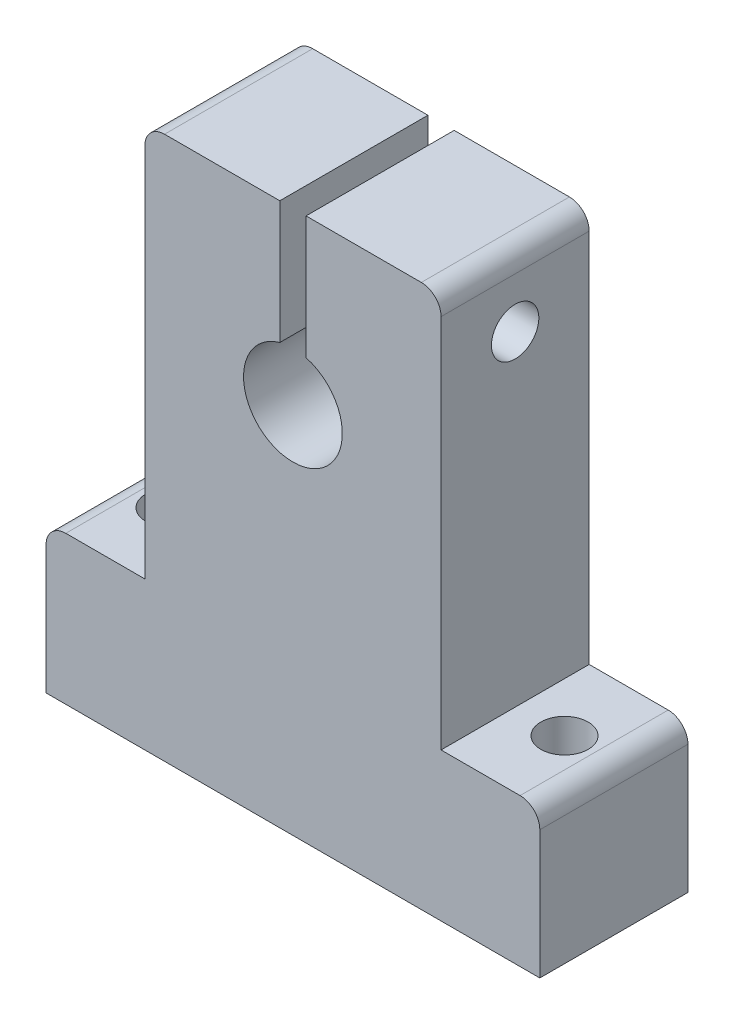
ISO-10303-21;
HEADER;
FILE_DESCRIPTION(('STEP AP214'),'2;1');
FILE_NAME('part.step','',(''),(''),'','','');
FILE_SCHEMA(('AUTOMOTIVE_DESIGN { 1 0 10303 214 1 1 1 1 }'));
ENDSEC;
DATA;
#1=APPLICATION_CONTEXT('core data for automotive mechanical design processes');
#2=APPLICATION_PROTOCOL_DEFINITION('international standard','automotive_design',2000,#1);
#3=PRODUCT_CONTEXT('',#1,'mechanical');
#4=PRODUCT('Part','Part','',(#3));
#5=PRODUCT_RELATED_PRODUCT_CATEGORY('part','',(#4));
#6=PRODUCT_DEFINITION_FORMATION('','',#4);
#7=PRODUCT_DEFINITION_CONTEXT('part definition',#1,'design');
#8=PRODUCT_DEFINITION('design','',#6,#7);
#9=PRODUCT_DEFINITION_SHAPE('','',#8);
#10=(LENGTH_UNIT() NAMED_UNIT(*) SI_UNIT(.MILLI.,.METRE.));
#11=(NAMED_UNIT(*) PLANE_ANGLE_UNIT() SI_UNIT($,.RADIAN.));
#12=(NAMED_UNIT(*) SI_UNIT($,.STERADIAN.) SOLID_ANGLE_UNIT());
#13=UNCERTAINTY_MEASURE_WITH_UNIT(LENGTH_MEASURE(1.E-05),#10,'distance_accuracy_value','');
#14=(GEOMETRIC_REPRESENTATION_CONTEXT(3) GLOBAL_UNCERTAINTY_ASSIGNED_CONTEXT((#13)) GLOBAL_UNIT_ASSIGNED_CONTEXT((#10,
#11,#12)) REPRESENTATION_CONTEXT('',''));
#15=CARTESIAN_POINT('',(0.,0.,0.));
#16=DIRECTION('',(0.,0.,1.));
#17=DIRECTION('',(1.,0.,0.));
#18=AXIS2_PLACEMENT_3D('',#15,#16,#17);
#19=CARTESIAN_POINT('',(0.,15.,0.));
#20=DIRECTION('',(0.,1.,0.));
#21=DIRECTION('',(0.,0.,1.));
#22=AXIS2_PLACEMENT_3D('',#19,#20,#21);
#23=PLANE('',#22);
#24=CARTESIAN_POINT('',(-20.,15.,0.));
#25=DIRECTION('',(0.,1.,0.));
#26=DIRECTION('',(0.,0.,1.));
#27=AXIS2_PLACEMENT_3D('',#24,#25,#26);
#28=CIRCLE('',#27,2.4);
#29=CARTESIAN_POINT('',(-20.,15.,2.4));
#30=VERTEX_POINT('',#29);
#31=EDGE_CURVE('E260',#30,#30,#28,.T.);
#32=ORIENTED_EDGE('',*,*,#31,.F.);
#33=EDGE_LOOP('',(#32));
#34=FACE_BOUND('',#33,.T.);
#35=DIRECTION('',(-1.,0.,0.));
#36=VECTOR('',#35,1.);
#37=CARTESIAN_POINT('',(25.,15.,-7.50000000000001));
#38=LINE('',#37,#36);
#39=CARTESIAN_POINT('',(-15.,15.,-7.5));
#40=VERTEX_POINT('',#39);
#41=CARTESIAN_POINT('',(-23.,15.,-7.5));
#42=VERTEX_POINT('',#41);
#43=EDGE_CURVE('E271',#40,#42,#38,.T.);
#44=ORIENTED_EDGE('',*,*,#43,.T.);
#45=DIRECTION('',(0.,0.,1.));
#46=VECTOR('',#45,1.);
#47=CARTESIAN_POINT('',(-23.,15.,7.5));
#48=LINE('',#47,#46);
#49=CARTESIAN_POINT('',(-23.,15.,7.5));
#50=VERTEX_POINT('',#49);
#51=EDGE_CURVE('E303',#42,#50,#48,.T.);
#52=ORIENTED_EDGE('',*,*,#51,.T.);
#53=DIRECTION('',(1.,0.,0.));
#54=VECTOR('',#53,1.);
#55=CARTESIAN_POINT('',(25.,15.,7.5));
#56=LINE('',#55,#54);
#57=CARTESIAN_POINT('',(-15.,15.,7.5));
#58=VERTEX_POINT('',#57);
#59=EDGE_CURVE('E268',#50,#58,#56,.T.);
#60=ORIENTED_EDGE('',*,*,#59,.T.);
#61=DIRECTION('',(0.,0.,-1.));
#62=VECTOR('',#61,1.);
#63=CARTESIAN_POINT('',(-15.,15.,57.5));
#64=LINE('',#63,#62);
#65=EDGE_CURVE('E184',#58,#40,#64,.T.);
#66=ORIENTED_EDGE('',*,*,#65,.T.);
#67=EDGE_LOOP('',(#44,#52,#60,#66));
#68=FACE_BOUND('',#67,.T.);
#69=ADVANCED_FACE('F42',(#34,#68),#23,.T.);
#70=CARTESIAN_POINT('',(15.,15.,7.5));
#71=VERTEX_POINT('',#70);
#72=CARTESIAN_POINT('',(23.,15.,7.5));
#73=VERTEX_POINT('',#72);
#74=EDGE_CURVE('E272',#71,#73,#56,.T.);
#75=ORIENTED_EDGE('',*,*,#74,.T.);
#76=DIRECTION('',(0.,0.,-1.));
#77=VECTOR('',#76,1.);
#78=CARTESIAN_POINT('',(23.,15.,-7.50000000000001));
#79=LINE('',#78,#77);
#80=CARTESIAN_POINT('',(23.,15.,-7.50000000000001));
#81=VERTEX_POINT('',#80);
#82=EDGE_CURVE('E52',#73,#81,#79,.T.);
#83=ORIENTED_EDGE('',*,*,#82,.T.);
#84=CARTESIAN_POINT('',(15.,15.,-7.50000000000001));
#85=VERTEX_POINT('',#84);
#86=EDGE_CURVE('E273',#81,#85,#38,.T.);
#87=ORIENTED_EDGE('',*,*,#86,.T.);
#88=DIRECTION('',(0.,0.,-1.));
#89=VECTOR('',#88,1.);
#90=CARTESIAN_POINT('',(15.,15.,57.5));
#91=LINE('',#90,#89);
#92=EDGE_CURVE('E166',#71,#85,#91,.T.);
#93=ORIENTED_EDGE('',*,*,#92,.F.);
#94=EDGE_LOOP('',(#75,#83,#87,#93));
#95=FACE_BOUND('',#94,.T.);
#96=CARTESIAN_POINT('',(20.,15.,0.));
#97=DIRECTION('',(0.,1.,0.));
#98=DIRECTION('',(0.,0.,-1.));
#99=AXIS2_PLACEMENT_3D('',#96,#97,#98);
#100=CIRCLE('',#99,2.4);
#101=CARTESIAN_POINT('',(20.,15.,-2.40000000000002));
#102=VERTEX_POINT('',#101);
#103=EDGE_CURVE('E252',#102,#102,#100,.T.);
#104=ORIENTED_EDGE('',*,*,#103,.F.);
#105=EDGE_LOOP('',(#104));
#106=FACE_BOUND('',#105,.T.);
#107=ADVANCED_FACE('F324',(#95,#106),#23,.T.);
#108=CARTESIAN_POINT('',(0.,0.,0.));
#109=DIRECTION('',(0.,1.,0.));
#110=DIRECTION('',(0.,0.,1.));
#111=AXIS2_PLACEMENT_3D('',#108,#109,#110);
#112=PLANE('',#111);
#113=DIRECTION('',(0.,0.,1.));
#114=VECTOR('',#113,1.);
#115=CARTESIAN_POINT('',(-25.,0.,7.5));
#116=LINE('',#115,#114);
#117=CARTESIAN_POINT('',(-25.,0.,-7.5));
#118=VERTEX_POINT('',#117);
#119=CARTESIAN_POINT('',(-25.,0.,7.5));
#120=VERTEX_POINT('',#119);
#121=EDGE_CURVE('E264',#118,#120,#116,.T.);
#122=ORIENTED_EDGE('',*,*,#121,.F.);
#123=DIRECTION('',(-1.,0.,0.));
#124=VECTOR('',#123,1.);
#125=CARTESIAN_POINT('',(25.,0.,-7.50000000000001));
#126=LINE('',#125,#124);
#127=CARTESIAN_POINT('',(25.,0.,-7.50000000000001));
#128=VERTEX_POINT('',#127);
#129=EDGE_CURVE('E288',#128,#118,#126,.T.);
#130=ORIENTED_EDGE('',*,*,#129,.F.);
#131=DIRECTION('',(0.,0.,-1.));
#132=VECTOR('',#131,1.);
#133=CARTESIAN_POINT('',(25.,0.,7.5));
#134=LINE('',#133,#132);
#135=CARTESIAN_POINT('',(25.,0.,7.5));
#136=VERTEX_POINT('',#135);
#137=EDGE_CURVE('E284',#136,#128,#134,.T.);
#138=ORIENTED_EDGE('',*,*,#137,.F.);
#139=DIRECTION('',(1.,0.,0.));
#140=VECTOR('',#139,1.);
#141=CARTESIAN_POINT('',(25.,0.,7.5));
#142=LINE('',#141,#140);
#143=EDGE_CURVE('E280',#120,#136,#142,.T.);
#144=ORIENTED_EDGE('',*,*,#143,.F.);
#145=EDGE_LOOP('',(#122,#130,#138,#144));
#146=FACE_BOUND('',#145,.T.);
#147=CARTESIAN_POINT('',(-20.,0.,0.));
#148=DIRECTION('',(0.,1.,0.));
#149=DIRECTION('',(0.,0.,1.));
#150=AXIS2_PLACEMENT_3D('',#147,#148,#149);
#151=CIRCLE('',#150,2.4);
#152=CARTESIAN_POINT('',(-20.,0.,2.4));
#153=VERTEX_POINT('',#152);
#154=EDGE_CURVE('E256',#153,#153,#151,.T.);
#155=ORIENTED_EDGE('',*,*,#154,.T.);
#156=EDGE_LOOP('',(#155));
#157=FACE_BOUND('',#156,.T.);
#158=CARTESIAN_POINT('',(20.,0.,0.));
#159=DIRECTION('',(0.,1.,0.));
#160=DIRECTION('',(0.,0.,-1.));
#161=AXIS2_PLACEMENT_3D('',#158,#159,#160);
#162=CIRCLE('',#161,2.4);
#163=CARTESIAN_POINT('',(20.,0.,-2.40000000000002));
#164=VERTEX_POINT('',#163);
#165=EDGE_CURVE('E226',#164,#164,#162,.T.);
#166=ORIENTED_EDGE('',*,*,#165,.T.);
#167=EDGE_LOOP('',(#166));
#168=FACE_BOUND('',#167,.T.);
#169=ADVANCED_FACE('F340',(#146,#157,#168),#112,.F.);
#170=CARTESIAN_POINT('',(-25.,15.,7.5));
#171=DIRECTION('',(1.,0.,0.));
#172=DIRECTION('',(0.,0.,-1.));
#173=AXIS2_PLACEMENT_3D('',#170,#171,#172);
#174=PLANE('',#173);
#175=DIRECTION('',(0.,-1.,0.));
#176=VECTOR('',#175,1.);
#177=CARTESIAN_POINT('',(-25.,15.,7.5));
#178=LINE('',#177,#176);
#179=CARTESIAN_POINT('',(-25.,13.,7.5));
#180=VERTEX_POINT('',#179);
#181=EDGE_CURVE('E300',#180,#120,#178,.T.);
#182=ORIENTED_EDGE('',*,*,#181,.F.);
#183=DIRECTION('',(0.,0.,1.));
#184=VECTOR('',#183,1.);
#185=CARTESIAN_POINT('',(-25.,13.,-7.5));
#186=LINE('',#185,#184);
#187=CARTESIAN_POINT('',(-25.,13.,-7.5));
#188=VERTEX_POINT('',#187);
#189=EDGE_CURVE('E313',#180,#188,#186,.F.);
#190=ORIENTED_EDGE('',*,*,#189,.T.);
#191=DIRECTION('',(0.,-1.,0.));
#192=VECTOR('',#191,1.);
#193=CARTESIAN_POINT('',(-25.,15.,-7.5));
#194=LINE('',#193,#192);
#195=EDGE_CURVE('E276',#188,#118,#194,.T.);
#196=ORIENTED_EDGE('',*,*,#195,.T.);
#197=ORIENTED_EDGE('',*,*,#121,.T.);
#198=EDGE_LOOP('',(#182,#190,#196,#197));
#199=FACE_BOUND('',#198,.T.);
#200=ADVANCED_FACE('F344',(#199),#174,.F.);
#201=CARTESIAN_POINT('',(25.,15.,7.5));
#202=DIRECTION('',(0.,0.,-1.));
#203=DIRECTION('',(-1.,0.,0.));
#204=AXIS2_PLACEMENT_3D('',#201,#202,#203);
#205=PLANE('',#204);
#206=ORIENTED_EDGE('',*,*,#59,.F.);
#207=CARTESIAN_POINT('',(-23.,13.,7.5));
#208=DIRECTION('',(0.,0.,-1.));
#209=DIRECTION('',(-1.,0.,0.));
#210=AXIS2_PLACEMENT_3D('',#207,#208,#209);
#211=CIRCLE('',#210,2.);
#212=EDGE_CURVE('E310',#50,#180,#211,.F.);
#213=ORIENTED_EDGE('',*,*,#212,.T.);
#214=ORIENTED_EDGE('',*,*,#181,.T.);
#215=ORIENTED_EDGE('',*,*,#143,.T.);
#216=DIRECTION('',(0.,-1.,0.));
#217=VECTOR('',#216,1.);
#218=CARTESIAN_POINT('',(25.,15.,7.5));
#219=LINE('',#218,#217);
#220=CARTESIAN_POINT('',(25.,13.,7.5));
#221=VERTEX_POINT('',#220);
#222=EDGE_CURVE('E297',#221,#136,#219,.T.);
#223=ORIENTED_EDGE('',*,*,#222,.F.);
#224=CARTESIAN_POINT('',(23.,13.,7.5));
#225=DIRECTION('',(0.,0.,-1.));
#226=DIRECTION('',(-1.,0.,0.));
#227=AXIS2_PLACEMENT_3D('',#224,#225,#226);
#228=CIRCLE('',#227,2.);
#229=EDGE_CURVE('E307',#221,#73,#228,.F.);
#230=ORIENTED_EDGE('',*,*,#229,.T.);
#231=ORIENTED_EDGE('',*,*,#74,.F.);
#232=DIRECTION('',(0.,-1.,0.));
#233=VECTOR('',#232,1.);
#234=CARTESIAN_POINT('',(15.,15.,7.5));
#235=LINE('',#234,#233);
#236=CARTESIAN_POINT('',(15.,53.,7.5));
#237=VERTEX_POINT('',#236);
#238=EDGE_CURVE('E224',#237,#71,#235,.T.);
#239=ORIENTED_EDGE('',*,*,#238,.F.);
#240=CARTESIAN_POINT('',(13.,53.,7.5));
#241=DIRECTION('',(0.,0.,-1.));
#242=DIRECTION('',(-1.,0.,0.));
#243=AXIS2_PLACEMENT_3D('',#240,#241,#242);
#244=CIRCLE('',#243,2.);
#245=CARTESIAN_POINT('',(13.,55.,7.5));
#246=VERTEX_POINT('',#245);
#247=EDGE_CURVE('E162',#246,#237,#244,.T.);
#248=ORIENTED_EDGE('',*,*,#247,.F.);
#249=DIRECTION('',(1.,0.,0.));
#250=VECTOR('',#249,1.);
#251=CARTESIAN_POINT('',(1.32872323638691,55.,7.5));
#252=LINE('',#251,#250);
#253=CARTESIAN_POINT('',(1.32872323638691,55.,7.5));
#254=VERTEX_POINT('',#253);
#255=EDGE_CURVE('E218',#254,#246,#252,.T.);
#256=ORIENTED_EDGE('',*,*,#255,.F.);
#257=DIRECTION('',(0.,1.,0.));
#258=VECTOR('',#257,1.);
#259=CARTESIAN_POINT('',(1.32872323638691,55.,7.5));
#260=LINE('',#259,#258);
#261=CARTESIAN_POINT('',(1.32872323638692,42.5668824538461,7.5));
#262=VERTEX_POINT('',#261);
#263=EDGE_CURVE('E214',#262,#254,#260,.T.);
#264=ORIENTED_EDGE('',*,*,#263,.F.);
#265=CARTESIAN_POINT('',(0.,37.7466651806222,7.5));
#266=DIRECTION('',(0.,0.,-1.));
#267=DIRECTION('',(-1.,0.,0.));
#268=AXIS2_PLACEMENT_3D('',#265,#266,#267);
#269=CIRCLE('',#268,5.);
#270=CARTESIAN_POINT('',(-1.32872323638689,42.5668824538461,7.5));
#271=VERTEX_POINT('',#270);
#272=EDGE_CURVE('E210',#271,#262,#269,.F.);
#273=ORIENTED_EDGE('',*,*,#272,.F.);
#274=DIRECTION('',(0.,-1.,0.));
#275=VECTOR('',#274,1.);
#276=CARTESIAN_POINT('',(-1.32872323638689,55.,7.5));
#277=LINE('',#276,#275);
#278=CARTESIAN_POINT('',(-1.32872323638689,55.,7.5));
#279=VERTEX_POINT('',#278);
#280=EDGE_CURVE('E206',#279,#271,#277,.T.);
#281=ORIENTED_EDGE('',*,*,#280,.F.);
#282=DIRECTION('',(1.,0.,0.));
#283=VECTOR('',#282,1.);
#284=CARTESIAN_POINT('',(-13.,55.,7.5));
#285=LINE('',#284,#283);
#286=CARTESIAN_POINT('',(-13.,55.,7.5));
#287=VERTEX_POINT('',#286);
#288=EDGE_CURVE('E201',#287,#279,#285,.T.);
#289=ORIENTED_EDGE('',*,*,#288,.F.);
#290=CARTESIAN_POINT('',(-13.,53.,7.5));
#291=DIRECTION('',(0.,0.,-1.));
#292=DIRECTION('',(-1.,0.,0.));
#293=AXIS2_PLACEMENT_3D('',#290,#291,#292);
#294=CIRCLE('',#293,2.);
#295=CARTESIAN_POINT('',(-15.,53.,7.5));
#296=VERTEX_POINT('',#295);
#297=EDGE_CURVE('E197',#296,#287,#294,.T.);
#298=ORIENTED_EDGE('',*,*,#297,.F.);
#299=DIRECTION('',(0.,1.,0.));
#300=VECTOR('',#299,1.);
#301=CARTESIAN_POINT('',(-15.,15.,7.5));
#302=LINE('',#301,#300);
#303=EDGE_CURVE('E202',#58,#296,#302,.T.);
#304=ORIENTED_EDGE('',*,*,#303,.F.);
#305=EDGE_LOOP('',(#206,#213,#214,#215,#223,#230,#231,#239,#248,#256,#264,#273,#281,#289,#298,#304));
#306=FACE_BOUND('',#305,.T.);
#307=ADVANCED_FACE('F331',(#306),#205,.F.);
#308=CARTESIAN_POINT('',(25.,15.,7.5));
#309=DIRECTION('',(-1.,0.,0.));
#310=DIRECTION('',(0.,0.,1.));
#311=AXIS2_PLACEMENT_3D('',#308,#309,#310);
#312=PLANE('',#311);
#313=DIRECTION('',(0.,-1.,0.));
#314=VECTOR('',#313,1.);
#315=CARTESIAN_POINT('',(25.,15.,-7.50000000000001));
#316=LINE('',#315,#314);
#317=CARTESIAN_POINT('',(25.,13.,-7.50000000000001));
#318=VERTEX_POINT('',#317);
#319=EDGE_CURVE('E294',#318,#128,#316,.T.);
#320=ORIENTED_EDGE('',*,*,#319,.F.);
#321=DIRECTION('',(0.,0.,-1.));
#322=VECTOR('',#321,1.);
#323=CARTESIAN_POINT('',(25.,13.,7.5));
#324=LINE('',#323,#322);
#325=EDGE_CURVE('E11',#318,#221,#324,.F.);
#326=ORIENTED_EDGE('',*,*,#325,.T.);
#327=ORIENTED_EDGE('',*,*,#222,.T.);
#328=ORIENTED_EDGE('',*,*,#137,.T.);
#329=EDGE_LOOP('',(#320,#326,#327,#328));
#330=FACE_BOUND('',#329,.T.);
#331=ADVANCED_FACE('F335',(#330),#312,.F.);
#332=CARTESIAN_POINT('',(25.,15.,-7.50000000000001));
#333=DIRECTION('',(0.,0.,1.));
#334=DIRECTION('',(1.,0.,0.));
#335=AXIS2_PLACEMENT_3D('',#332,#333,#334);
#336=PLANE('',#335);
#337=ORIENTED_EDGE('',*,*,#195,.F.);
#338=CARTESIAN_POINT('',(-23.,13.,-7.5));
#339=DIRECTION('',(0.,0.,1.));
#340=DIRECTION('',(1.,0.,0.));
#341=AXIS2_PLACEMENT_3D('',#338,#339,#340);
#342=CIRCLE('',#341,2.);
#343=EDGE_CURVE('E318',#188,#42,#342,.F.);
#344=ORIENTED_EDGE('',*,*,#343,.T.);
#345=ORIENTED_EDGE('',*,*,#43,.F.);
#346=DIRECTION('',(0.,1.,0.));
#347=VECTOR('',#346,1.);
#348=CARTESIAN_POINT('',(-15.,15.,-7.5));
#349=LINE('',#348,#347);
#350=CARTESIAN_POINT('',(-15.,53.,-7.5));
#351=VERTEX_POINT('',#350);
#352=EDGE_CURVE('E185',#40,#351,#349,.T.);
#353=ORIENTED_EDGE('',*,*,#352,.T.);
#354=CARTESIAN_POINT('',(-13.,53.,-7.5));
#355=DIRECTION('',(0.,0.,1.));
#356=DIRECTION('',(1.,0.,0.));
#357=AXIS2_PLACEMENT_3D('',#354,#355,#356);
#358=CIRCLE('',#357,2.);
#359=CARTESIAN_POINT('',(-13.,55.,-7.5));
#360=VERTEX_POINT('',#359);
#361=EDGE_CURVE('E193',#351,#360,#358,.F.);
#362=ORIENTED_EDGE('',*,*,#361,.T.);
#363=DIRECTION('',(1.,0.,0.));
#364=VECTOR('',#363,1.);
#365=CARTESIAN_POINT('',(-13.,55.,-7.5));
#366=LINE('',#365,#364);
#367=CARTESIAN_POINT('',(-1.32872323638689,55.,-7.5));
#368=VERTEX_POINT('',#367);
#369=EDGE_CURVE('E367',#360,#368,#366,.T.);
#370=ORIENTED_EDGE('',*,*,#369,.T.);
#371=DIRECTION('',(0.,-1.,0.));
#372=VECTOR('',#371,1.);
#373=CARTESIAN_POINT('',(-1.32872323638689,55.,-7.5));
#374=LINE('',#373,#372);
#375=CARTESIAN_POINT('',(-1.32872323638689,42.5668824538461,-7.50000000000001));
#376=VERTEX_POINT('',#375);
#377=EDGE_CURVE('E369',#368,#376,#374,.T.);
#378=ORIENTED_EDGE('',*,*,#377,.T.);
#379=CARTESIAN_POINT('',(0.,37.7466651806222,-7.50000000000001));
#380=DIRECTION('',(0.,0.,1.));
#381=DIRECTION('',(1.,0.,0.));
#382=AXIS2_PLACEMENT_3D('',#379,#380,#381);
#383=CIRCLE('',#382,5.);
#384=CARTESIAN_POINT('',(1.32872323638691,42.5668824538461,-7.50000000000001));
#385=VERTEX_POINT('',#384);
#386=EDGE_CURVE('E375',#376,#385,#383,.T.);
#387=ORIENTED_EDGE('',*,*,#386,.T.);
#388=DIRECTION('',(0.,1.,0.));
#389=VECTOR('',#388,1.);
#390=CARTESIAN_POINT('',(1.32872323638691,55.,-7.50000000000001));
#391=LINE('',#390,#389);
#392=CARTESIAN_POINT('',(1.32872323638691,55.,-7.50000000000001));
#393=VERTEX_POINT('',#392);
#394=EDGE_CURVE('E379',#385,#393,#391,.T.);
#395=ORIENTED_EDGE('',*,*,#394,.T.);
#396=DIRECTION('',(1.,0.,0.));
#397=VECTOR('',#396,1.);
#398=CARTESIAN_POINT('',(1.32872323638692,55.,-7.50000000000001));
#399=LINE('',#398,#397);
#400=CARTESIAN_POINT('',(13.,55.,-7.50000000000001));
#401=VERTEX_POINT('',#400);
#402=EDGE_CURVE('E176',#393,#401,#399,.T.);
#403=ORIENTED_EDGE('',*,*,#402,.T.);
#404=CARTESIAN_POINT('',(13.,53.,-7.50000000000001));
#405=DIRECTION('',(0.,0.,1.));
#406=DIRECTION('',(1.,0.,0.));
#407=AXIS2_PLACEMENT_3D('',#404,#405,#406);
#408=CIRCLE('',#407,2.);
#409=CARTESIAN_POINT('',(15.,53.,-7.50000000000001));
#410=VERTEX_POINT('',#409);
#411=EDGE_CURVE('E161',#401,#410,#408,.F.);
#412=ORIENTED_EDGE('',*,*,#411,.T.);
#413=DIRECTION('',(0.,-1.,0.));
#414=VECTOR('',#413,1.);
#415=CARTESIAN_POINT('',(15.,15.,-7.50000000000001));
#416=LINE('',#415,#414);
#417=EDGE_CURVE('E173',#410,#85,#416,.T.);
#418=ORIENTED_EDGE('',*,*,#417,.T.);
#419=ORIENTED_EDGE('',*,*,#86,.F.);
#420=CARTESIAN_POINT('',(23.,13.,-7.50000000000001));
#421=DIRECTION('',(0.,0.,1.));
#422=DIRECTION('',(1.,0.,0.));
#423=AXIS2_PLACEMENT_3D('',#420,#421,#422);
#424=CIRCLE('',#423,2.);
#425=EDGE_CURVE('E59',#81,#318,#424,.F.);
#426=ORIENTED_EDGE('',*,*,#425,.T.);
#427=ORIENTED_EDGE('',*,*,#319,.T.);
#428=ORIENTED_EDGE('',*,*,#129,.T.);
#429=EDGE_LOOP('',(#337,#344,#345,#353,#362,#370,#378,#387,#395,#403,#412,#418,#419,#426,#427,#428));
#430=FACE_BOUND('',#429,.T.);
#431=ADVANCED_FACE('F172',(#430),#336,.F.);
#432=CARTESIAN_POINT('',(-20.,15.,0.));
#433=DIRECTION('',(0.,-1.,0.));
#434=DIRECTION('',(0.,0.,-1.));
#435=AXIS2_PLACEMENT_3D('',#432,#433,#434);
#436=CYLINDRICAL_SURFACE('',#435,2.4);
#437=ORIENTED_EDGE('',*,*,#31,.T.);
#438=EDGE_LOOP('',(#437));
#439=FACE_BOUND('',#438,.T.);
#440=ORIENTED_EDGE('',*,*,#154,.F.);
#441=EDGE_LOOP('',(#440));
#442=FACE_BOUND('',#441,.T.);
#443=ADVANCED_FACE('F446',(#439,#442),#436,.F.);
#444=CARTESIAN_POINT('',(20.,15.,0.));
#445=DIRECTION('',(0.,-1.,0.));
#446=DIRECTION('',(0.,0.,-1.));
#447=AXIS2_PLACEMENT_3D('',#444,#445,#446);
#448=CYLINDRICAL_SURFACE('',#447,2.4);
#449=ORIENTED_EDGE('',*,*,#103,.T.);
#450=EDGE_LOOP('',(#449));
#451=FACE_BOUND('',#450,.T.);
#452=ORIENTED_EDGE('',*,*,#165,.F.);
#453=EDGE_LOOP('',(#452));
#454=FACE_BOUND('',#453,.T.);
#455=ADVANCED_FACE('F469',(#451,#454),#448,.F.);
#456=CARTESIAN_POINT('',(-15.,15.,57.5));
#457=DIRECTION('',(1.,0.,0.));
#458=DIRECTION('',(0.,0.,-1.));
#459=AXIS2_PLACEMENT_3D('',#456,#457,#458);
#460=PLANE('',#459);
#461=CARTESIAN_POINT('',(-15.,47.9348408730862,0.));
#462=DIRECTION('',(-1.,0.,0.));
#463=DIRECTION('',(0.,0.,1.));
#464=AXIS2_PLACEMENT_3D('',#461,#462,#463);
#465=CIRCLE('',#464,2.4);
#466=CARTESIAN_POINT('',(-15.,47.9348408730862,2.4));
#467=VERTEX_POINT('',#466);
#468=EDGE_CURVE('E391',#467,#467,#465,.T.);
#469=ORIENTED_EDGE('',*,*,#468,.F.);
#470=EDGE_LOOP('',(#469));
#471=FACE_BOUND('',#470,.T.);
#472=ORIENTED_EDGE('',*,*,#65,.F.);
#473=ORIENTED_EDGE('',*,*,#303,.T.);
#474=DIRECTION('',(0.,0.,-1.));
#475=VECTOR('',#474,1.);
#476=CARTESIAN_POINT('',(-15.,53.,57.5));
#477=LINE('',#476,#475);
#478=EDGE_CURVE('E190',#296,#351,#477,.T.);
#479=ORIENTED_EDGE('',*,*,#478,.T.);
#480=ORIENTED_EDGE('',*,*,#352,.F.);
#481=EDGE_LOOP('',(#472,#473,#479,#480));
#482=FACE_BOUND('',#481,.T.);
#483=ADVANCED_FACE('F357',(#471,#482),#460,.F.);
#484=CARTESIAN_POINT('',(-13.,53.,57.5));
#485=DIRECTION('',(0.,0.,-1.));
#486=DIRECTION('',(-1.,0.,0.));
#487=AXIS2_PLACEMENT_3D('',#484,#485,#486);
#488=CYLINDRICAL_SURFACE('',#487,2.);
#489=ORIENTED_EDGE('',*,*,#478,.F.);
#490=ORIENTED_EDGE('',*,*,#297,.T.);
#491=DIRECTION('',(0.,0.,-1.));
#492=VECTOR('',#491,1.);
#493=CARTESIAN_POINT('',(-13.,55.,57.5));
#494=LINE('',#493,#492);
#495=EDGE_CURVE('E230',#287,#360,#494,.T.);
#496=ORIENTED_EDGE('',*,*,#495,.T.);
#497=ORIENTED_EDGE('',*,*,#361,.F.);
#498=EDGE_LOOP('',(#489,#490,#496,#497));
#499=FACE_BOUND('',#498,.T.);
#500=ADVANCED_FACE('F364',(#499),#488,.T.);
#501=CARTESIAN_POINT('',(-13.,55.,57.5));
#502=DIRECTION('',(0.,-1.,0.));
#503=DIRECTION('',(0.,0.,-1.));
#504=AXIS2_PLACEMENT_3D('',#501,#502,#503);
#505=PLANE('',#504);
#506=ORIENTED_EDGE('',*,*,#495,.F.);
#507=ORIENTED_EDGE('',*,*,#288,.T.);
#508=DIRECTION('',(0.,0.,-1.));
#509=VECTOR('',#508,1.);
#510=CARTESIAN_POINT('',(-1.32872323638689,55.,57.5));
#511=LINE('',#510,#509);
#512=EDGE_CURVE('E233',#279,#368,#511,.T.);
#513=ORIENTED_EDGE('',*,*,#512,.T.);
#514=ORIENTED_EDGE('',*,*,#369,.F.);
#515=EDGE_LOOP('',(#506,#507,#513,#514));
#516=FACE_BOUND('',#515,.T.);
#517=ADVANCED_FACE('F426',(#516),#505,.F.);
#518=CARTESIAN_POINT('',(-1.32872323638689,55.,57.5));
#519=DIRECTION('',(-1.,0.,0.));
#520=DIRECTION('',(0.,0.,1.));
#521=AXIS2_PLACEMENT_3D('',#518,#519,#520);
#522=PLANE('',#521);
#523=CARTESIAN_POINT('',(-1.32872323638689,47.9348408730862,0.));
#524=DIRECTION('',(-1.,0.,0.));
#525=DIRECTION('',(0.,0.,1.));
#526=AXIS2_PLACEMENT_3D('',#523,#524,#525);
#527=CIRCLE('',#526,2.4);
#528=CARTESIAN_POINT('',(-1.32872323638689,47.9348408730862,2.4));
#529=VERTEX_POINT('',#528);
#530=EDGE_CURVE('E178',#529,#529,#527,.T.);
#531=ORIENTED_EDGE('',*,*,#530,.T.);
#532=EDGE_LOOP('',(#531));
#533=FACE_BOUND('',#532,.T.);
#534=ORIENTED_EDGE('',*,*,#512,.F.);
#535=ORIENTED_EDGE('',*,*,#280,.T.);
#536=DIRECTION('',(0.,0.,-1.));
#537=VECTOR('',#536,1.);
#538=CARTESIAN_POINT('',(-1.32872323638689,42.5668824538461,57.5));
#539=LINE('',#538,#537);
#540=EDGE_CURVE('E236',#271,#376,#539,.T.);
#541=ORIENTED_EDGE('',*,*,#540,.T.);
#542=ORIENTED_EDGE('',*,*,#377,.F.);
#543=EDGE_LOOP('',(#534,#535,#541,#542));
#544=FACE_BOUND('',#543,.T.);
#545=ADVANCED_FACE('F424',(#533,#544),#522,.F.);
#546=CARTESIAN_POINT('',(0.,37.7466651806222,57.5));
#547=DIRECTION('',(0.,0.,-1.));
#548=DIRECTION('',(-1.,0.,0.));
#549=AXIS2_PLACEMENT_3D('',#546,#547,#548);
#550=CYLINDRICAL_SURFACE('',#549,5.);
#551=ORIENTED_EDGE('',*,*,#540,.F.);
#552=ORIENTED_EDGE('',*,*,#272,.T.);
#553=DIRECTION('',(0.,0.,-1.));
#554=VECTOR('',#553,1.);
#555=CARTESIAN_POINT('',(1.32872323638692,42.5668824538461,57.5));
#556=LINE('',#555,#554);
#557=EDGE_CURVE('E239',#262,#385,#556,.T.);
#558=ORIENTED_EDGE('',*,*,#557,.T.);
#559=ORIENTED_EDGE('',*,*,#386,.F.);
#560=EDGE_LOOP('',(#551,#552,#558,#559));
#561=FACE_BOUND('',#560,.T.);
#562=ADVANCED_FACE('F412',(#561),#550,.F.);
#563=CARTESIAN_POINT('',(1.32872323638691,55.,57.5));
#564=DIRECTION('',(1.,0.,0.));
#565=DIRECTION('',(0.,0.,-1.));
#566=AXIS2_PLACEMENT_3D('',#563,#564,#565);
#567=PLANE('',#566);
#568=CARTESIAN_POINT('',(1.32872323638691,47.9348408730862,0.));
#569=DIRECTION('',(1.,0.,0.));
#570=DIRECTION('',(0.,0.,-1.));
#571=AXIS2_PLACEMENT_3D('',#568,#569,#570);
#572=CIRCLE('',#571,2.4);
#573=CARTESIAN_POINT('',(1.32872323638691,47.9348408730862,-2.4));
#574=VERTEX_POINT('',#573);
#575=EDGE_CURVE('E387',#574,#574,#572,.T.);
#576=ORIENTED_EDGE('',*,*,#575,.T.);
#577=EDGE_LOOP('',(#576));
#578=FACE_BOUND('',#577,.T.);
#579=ORIENTED_EDGE('',*,*,#557,.F.);
#580=ORIENTED_EDGE('',*,*,#263,.T.);
#581=DIRECTION('',(0.,0.,-1.));
#582=VECTOR('',#581,1.);
#583=CARTESIAN_POINT('',(1.32872323638691,55.,57.5));
#584=LINE('',#583,#582);
#585=EDGE_CURVE('E242',#254,#393,#584,.T.);
#586=ORIENTED_EDGE('',*,*,#585,.T.);
#587=ORIENTED_EDGE('',*,*,#394,.F.);
#588=EDGE_LOOP('',(#579,#580,#586,#587));
#589=FACE_BOUND('',#588,.T.);
#590=ADVANCED_FACE('F408',(#578,#589),#567,.F.);
#591=CARTESIAN_POINT('',(1.32872323638691,55.,57.5));
#592=DIRECTION('',(0.,-1.,0.));
#593=DIRECTION('',(0.,0.,-1.));
#594=AXIS2_PLACEMENT_3D('',#591,#592,#593);
#595=PLANE('',#594);
#596=ORIENTED_EDGE('',*,*,#585,.F.);
#597=ORIENTED_EDGE('',*,*,#255,.T.);
#598=DIRECTION('',(0.,0.,-1.));
#599=VECTOR('',#598,1.);
#600=CARTESIAN_POINT('',(13.,55.,57.5));
#601=LINE('',#600,#599);
#602=EDGE_CURVE('E167',#246,#401,#601,.T.);
#603=ORIENTED_EDGE('',*,*,#602,.T.);
#604=ORIENTED_EDGE('',*,*,#402,.F.);
#605=EDGE_LOOP('',(#596,#597,#603,#604));
#606=FACE_BOUND('',#605,.T.);
#607=ADVANCED_FACE('F411',(#606),#595,.F.);
#608=CARTESIAN_POINT('',(13.,53.,57.5));
#609=DIRECTION('',(0.,0.,-1.));
#610=DIRECTION('',(-1.,0.,0.));
#611=AXIS2_PLACEMENT_3D('',#608,#609,#610);
#612=CYLINDRICAL_SURFACE('',#611,2.);
#613=ORIENTED_EDGE('',*,*,#602,.F.);
#614=ORIENTED_EDGE('',*,*,#247,.T.);
#615=DIRECTION('',(0.,0.,-1.));
#616=VECTOR('',#615,1.);
#617=CARTESIAN_POINT('',(15.,53.,57.5));
#618=LINE('',#617,#616);
#619=EDGE_CURVE('E157',#237,#410,#618,.T.);
#620=ORIENTED_EDGE('',*,*,#619,.T.);
#621=ORIENTED_EDGE('',*,*,#411,.F.);
#622=EDGE_LOOP('',(#613,#614,#620,#621));
#623=FACE_BOUND('',#622,.T.);
#624=ADVANCED_FACE('F160',(#623),#612,.T.);
#625=CARTESIAN_POINT('',(15.,15.,57.5));
#626=DIRECTION('',(-1.,0.,0.));
#627=DIRECTION('',(0.,0.,1.));
#628=AXIS2_PLACEMENT_3D('',#625,#626,#627);
#629=PLANE('',#628);
#630=CARTESIAN_POINT('',(15.,47.9348408730862,0.));
#631=DIRECTION('',(-1.,0.,0.));
#632=DIRECTION('',(0.,0.,1.));
#633=AXIS2_PLACEMENT_3D('',#630,#631,#632);
#634=CIRCLE('',#633,2.4);
#635=CARTESIAN_POINT('',(15.,47.9348408730862,2.4));
#636=VERTEX_POINT('',#635);
#637=EDGE_CURVE('E46',#636,#636,#634,.T.);
#638=ORIENTED_EDGE('',*,*,#637,.T.);
#639=EDGE_LOOP('',(#638));
#640=FACE_BOUND('',#639,.T.);
#641=ORIENTED_EDGE('',*,*,#619,.F.);
#642=ORIENTED_EDGE('',*,*,#238,.T.);
#643=ORIENTED_EDGE('',*,*,#92,.T.);
#644=ORIENTED_EDGE('',*,*,#417,.F.);
#645=EDGE_LOOP('',(#641,#642,#643,#644));
#646=FACE_BOUND('',#645,.T.);
#647=ADVANCED_FACE('F181',(#640,#646),#629,.F.);
#648=CARTESIAN_POINT('',(-23.,13.,0.));
#649=DIRECTION('',(0.,0.,-1.));
#650=DIRECTION('',(-1.,0.,0.));
#651=AXIS2_PLACEMENT_3D('',#648,#649,#650);
#652=CYLINDRICAL_SURFACE('',#651,2.);
#653=ORIENTED_EDGE('',*,*,#343,.F.);
#654=ORIENTED_EDGE('',*,*,#189,.F.);
#655=ORIENTED_EDGE('',*,*,#212,.F.);
#656=ORIENTED_EDGE('',*,*,#51,.F.);
#657=EDGE_LOOP('',(#653,#654,#655,#656));
#658=FACE_BOUND('',#657,.T.);
#659=ADVANCED_FACE('F347',(#658),#652,.T.);
#660=CARTESIAN_POINT('',(23.,13.,0.));
#661=DIRECTION('',(0.,0.,1.));
#662=DIRECTION('',(1.,0.,0.));
#663=AXIS2_PLACEMENT_3D('',#660,#661,#662);
#664=CYLINDRICAL_SURFACE('',#663,2.);
#665=ORIENTED_EDGE('',*,*,#229,.F.);
#666=ORIENTED_EDGE('',*,*,#325,.F.);
#667=ORIENTED_EDGE('',*,*,#425,.F.);
#668=ORIENTED_EDGE('',*,*,#82,.F.);
#669=EDGE_LOOP('',(#665,#666,#667,#668));
#670=FACE_BOUND('',#669,.T.);
#671=ADVANCED_FACE('F44',(#670),#664,.T.);
#672=CARTESIAN_POINT('',(25.,47.9348408730862,0.));
#673=DIRECTION('',(-1.,0.,0.));
#674=DIRECTION('',(0.,0.,1.));
#675=AXIS2_PLACEMENT_3D('',#672,#673,#674);
#676=CYLINDRICAL_SURFACE('',#675,2.4);
#677=ORIENTED_EDGE('',*,*,#637,.F.);
#678=EDGE_LOOP('',(#677));
#679=FACE_BOUND('',#678,.T.);
#680=ORIENTED_EDGE('',*,*,#575,.F.);
#681=EDGE_LOOP('',(#680));
#682=FACE_BOUND('',#681,.T.);
#683=ADVANCED_FACE('F401',(#679,#682),#676,.F.);
#684=ORIENTED_EDGE('',*,*,#468,.T.);
#685=EDGE_LOOP('',(#684));
#686=FACE_BOUND('',#685,.T.);
#687=ORIENTED_EDGE('',*,*,#530,.F.);
#688=EDGE_LOOP('',(#687));
#689=FACE_BOUND('',#688,.T.);
#690=ADVANCED_FACE('F404',(#686,#689),#676,.F.);
#691=CLOSED_SHELL('',(#69,#107,#169,#200,#307,#331,#431,#443,#455,#483,#500,#517,#545,#562,#590,
#607,#624,#647,#659,#671,#683,#690));
#692=MANIFOLD_SOLID_BREP('B2',#691);
#693=ADVANCED_BREP_SHAPE_REPRESENTATION('',(#18,#692),#14);
#694=SHAPE_DEFINITION_REPRESENTATION(#9,#693);
ENDSEC;
END-ISO-10303-21;
